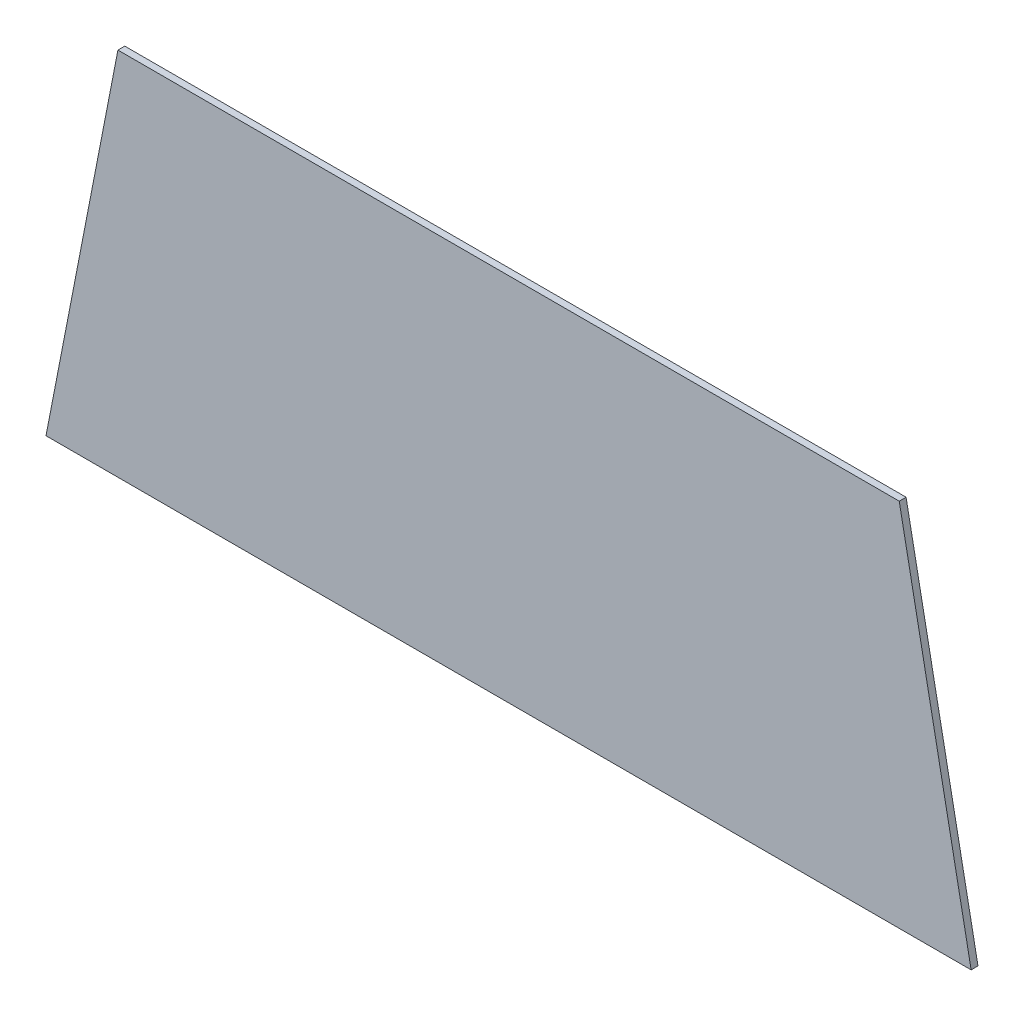
ISO-10303-21;
HEADER;
FILE_DESCRIPTION(('STEP AP214'),'2;1');
FILE_NAME('part.step','',(''),(''),'','','');
FILE_SCHEMA(('AUTOMOTIVE_DESIGN { 1 0 10303 214 1 1 1 1 }'));
ENDSEC;
DATA;
#1=APPLICATION_CONTEXT('core data for automotive mechanical design processes');
#2=APPLICATION_PROTOCOL_DEFINITION('international standard','automotive_design',2000,#1);
#3=PRODUCT_CONTEXT('',#1,'mechanical');
#4=PRODUCT('Part','Part','',(#3));
#5=PRODUCT_RELATED_PRODUCT_CATEGORY('part','',(#4));
#6=PRODUCT_DEFINITION_FORMATION('','',#4);
#7=PRODUCT_DEFINITION_CONTEXT('part definition',#1,'design');
#8=PRODUCT_DEFINITION('design','',#6,#7);
#9=PRODUCT_DEFINITION_SHAPE('','',#8);
#10=(LENGTH_UNIT() NAMED_UNIT(*) SI_UNIT(.MILLI.,.METRE.));
#11=(NAMED_UNIT(*) PLANE_ANGLE_UNIT() SI_UNIT($,.RADIAN.));
#12=(NAMED_UNIT(*) SI_UNIT($,.STERADIAN.) SOLID_ANGLE_UNIT());
#13=UNCERTAINTY_MEASURE_WITH_UNIT(LENGTH_MEASURE(1.E-05),#10,'distance_accuracy_value','');
#14=(GEOMETRIC_REPRESENTATION_CONTEXT(3) GLOBAL_UNCERTAINTY_ASSIGNED_CONTEXT((#13)) GLOBAL_UNIT_ASSIGNED_CONTEXT((#10,
#11,#12)) REPRESENTATION_CONTEXT('',''));
#15=CARTESIAN_POINT('',(0.,0.,0.));
#16=DIRECTION('',(0.,0.,1.));
#17=DIRECTION('',(1.,0.,0.));
#18=AXIS2_PLACEMENT_3D('',#15,#16,#17);
#19=CARTESIAN_POINT('',(-0.67499992,-0.26994612,0.01));
#20=DIRECTION('',(0.,0.,1.));
#21=DIRECTION('',(1.,0.,0.));
#22=AXIS2_PLACEMENT_3D('',#19,#20,#21);
#23=PLANE('',#22);
#24=DIRECTION('',(1.,0.,0.));
#25=VECTOR('',#24,1.);
#26=CARTESIAN_POINT('',(-0.57005474,0.26994866,0.01));
#27=LINE('',#26,#25);
#28=CARTESIAN_POINT('',(-0.57005474,0.26994866,0.01));
#29=VERTEX_POINT('',#28);
#30=CARTESIAN_POINT('',(0.57005474,0.26994866,0.01));
#31=VERTEX_POINT('',#30);
#32=EDGE_CURVE('E69',#29,#31,#27,.T.);
#33=ORIENTED_EDGE('',*,*,#32,.F.);
#34=DIRECTION('',(-0.190809460987009,-0.981627092942043,0.));
#35=VECTOR('',#34,1.);
#36=CARTESIAN_POINT('',(-0.57005474,0.26994866,0.01));
#37=LINE('',#36,#35);
#38=CARTESIAN_POINT('',(-0.67499992,-0.26994612,0.01));
#39=VERTEX_POINT('',#38);
#40=EDGE_CURVE('E72',#29,#39,#37,.T.);
#41=ORIENTED_EDGE('',*,*,#40,.T.);
#42=DIRECTION('',(-1.,0.,0.));
#43=VECTOR('',#42,1.);
#44=CARTESIAN_POINT('',(0.67499992,-0.26994612,0.01));
#45=LINE('',#44,#43);
#46=CARTESIAN_POINT('',(0.67499992,-0.26994612,0.01));
#47=VERTEX_POINT('',#46);
#48=EDGE_CURVE('E11',#47,#39,#45,.T.);
#49=ORIENTED_EDGE('',*,*,#48,.F.);
#50=DIRECTION('',(0.190809460987009,-0.981627092942043,0.));
#51=VECTOR('',#50,1.);
#52=CARTESIAN_POINT('',(0.57005474,0.26994866,0.01));
#53=LINE('',#52,#51);
#54=EDGE_CURVE('E27',#31,#47,#53,.T.);
#55=ORIENTED_EDGE('',*,*,#54,.F.);
#56=EDGE_LOOP('',(#33,#41,#49,#55));
#57=FACE_BOUND('',#56,.T.);
#58=ADVANCED_FACE('F16',(#57),#23,.T.);
#59=CARTESIAN_POINT('',(0.67499992,-0.26994612,0.));
#60=DIRECTION('',(0.,-1.,0.));
#61=DIRECTION('',(0.,0.,-1.));
#62=AXIS2_PLACEMENT_3D('',#59,#60,#61);
#63=PLANE('',#62);
#64=DIRECTION('',(0.,0.,1.));
#65=VECTOR('',#64,1.);
#66=CARTESIAN_POINT('',(-0.67499992,-0.26994612,0.));
#67=LINE('',#66,#65);
#68=CARTESIAN_POINT('',(-0.67499992,-0.26994612,0.));
#69=VERTEX_POINT('',#68);
#70=EDGE_CURVE('E116',#69,#39,#67,.T.);
#71=ORIENTED_EDGE('',*,*,#70,.F.);
#72=DIRECTION('',(1.,0.,0.));
#73=VECTOR('',#72,1.);
#74=CARTESIAN_POINT('',(-0.67499992,-0.26994612,0.));
#75=LINE('',#74,#73);
#76=CARTESIAN_POINT('',(0.67499992,-0.26994612,0.));
#77=VERTEX_POINT('',#76);
#78=EDGE_CURVE('E84',#69,#77,#75,.T.);
#79=ORIENTED_EDGE('',*,*,#78,.T.);
#80=DIRECTION('',(0.,0.,-1.));
#81=VECTOR('',#80,1.);
#82=CARTESIAN_POINT('',(0.67499992,-0.26994612,0.));
#83=LINE('',#82,#81);
#84=EDGE_CURVE('E79',#47,#77,#83,.T.);
#85=ORIENTED_EDGE('',*,*,#84,.F.);
#86=ORIENTED_EDGE('',*,*,#48,.T.);
#87=EDGE_LOOP('',(#71,#79,#85,#86));
#88=FACE_BOUND('',#87,.T.);
#89=ADVANCED_FACE('F182',(#88),#63,.T.);
#90=CARTESIAN_POINT('',(0.57005474,0.26994866,0.));
#91=DIRECTION('',(0.981627092942043,0.190809460987009,0.));
#92=DIRECTION('',(0.,0.,-1.));
#93=AXIS2_PLACEMENT_3D('',#90,#91,#92);
#94=PLANE('',#93);
#95=ORIENTED_EDGE('',*,*,#84,.T.);
#96=DIRECTION('',(-0.190809460987009,0.981627092942043,0.));
#97=VECTOR('',#96,1.);
#98=CARTESIAN_POINT('',(0.67499992,-0.26994612,0.));
#99=LINE('',#98,#97);
#100=CARTESIAN_POINT('',(0.57005474,0.26994866,0.));
#101=VERTEX_POINT('',#100);
#102=EDGE_CURVE('E76',#77,#101,#99,.T.);
#103=ORIENTED_EDGE('',*,*,#102,.T.);
#104=DIRECTION('',(0.,0.,-1.));
#105=VECTOR('',#104,1.);
#106=CARTESIAN_POINT('',(0.57005474,0.26994866,0.));
#107=LINE('',#106,#105);
#108=EDGE_CURVE('E65',#31,#101,#107,.T.);
#109=ORIENTED_EDGE('',*,*,#108,.F.);
#110=ORIENTED_EDGE('',*,*,#54,.T.);
#111=EDGE_LOOP('',(#95,#103,#109,#110));
#112=FACE_BOUND('',#111,.T.);
#113=ADVANCED_FACE('F77',(#112),#94,.T.);
#114=CARTESIAN_POINT('',(-0.57005474,0.26994866,0.));
#115=DIRECTION('',(0.,1.,0.));
#116=DIRECTION('',(1.,0.,0.));
#117=AXIS2_PLACEMENT_3D('',#114,#115,#116);
#118=PLANE('',#117);
#119=ORIENTED_EDGE('',*,*,#108,.T.);
#120=DIRECTION('',(-1.,0.,0.));
#121=VECTOR('',#120,1.);
#122=CARTESIAN_POINT('',(-0.67499992,0.26994866,0.));
#123=LINE('',#122,#121);
#124=CARTESIAN_POINT('',(-0.57005474,0.26994866,0.));
#125=VERTEX_POINT('',#124);
#126=EDGE_CURVE('E20',#101,#125,#123,.T.);
#127=ORIENTED_EDGE('',*,*,#126,.T.);
#128=DIRECTION('',(0.,0.,-1.));
#129=VECTOR('',#128,1.);
#130=CARTESIAN_POINT('',(-0.57005474,0.26994866,0.));
#131=LINE('',#130,#129);
#132=EDGE_CURVE('E112',#29,#125,#131,.T.);
#133=ORIENTED_EDGE('',*,*,#132,.F.);
#134=ORIENTED_EDGE('',*,*,#32,.T.);
#135=EDGE_LOOP('',(#119,#127,#133,#134));
#136=FACE_BOUND('',#135,.T.);
#137=ADVANCED_FACE('F18',(#136),#118,.T.);
#138=CARTESIAN_POINT('',(-0.67499992,-0.26994612,0.));
#139=DIRECTION('',(-0.981627092942043,0.190809460987009,0.));
#140=DIRECTION('',(0.,0.,1.));
#141=AXIS2_PLACEMENT_3D('',#138,#139,#140);
#142=PLANE('',#141);
#143=ORIENTED_EDGE('',*,*,#132,.T.);
#144=DIRECTION('',(-0.190809460987009,-0.981627092942043,0.));
#145=VECTOR('',#144,1.);
#146=CARTESIAN_POINT('',(-0.57005474,0.26994866,0.));
#147=LINE('',#146,#145);
#148=EDGE_CURVE('E89',#125,#69,#147,.T.);
#149=ORIENTED_EDGE('',*,*,#148,.T.);
#150=ORIENTED_EDGE('',*,*,#70,.T.);
#151=ORIENTED_EDGE('',*,*,#40,.F.);
#152=EDGE_LOOP('',(#143,#149,#150,#151));
#153=FACE_BOUND('',#152,.T.);
#154=ADVANCED_FACE('F154',(#153),#142,.T.);
#155=CARTESIAN_POINT('',(-0.67499992,-0.26994612,0.));
#156=DIRECTION('',(0.,0.,1.));
#157=DIRECTION('',(1.,0.,0.));
#158=AXIS2_PLACEMENT_3D('',#155,#156,#157);
#159=PLANE('',#158);
#160=ORIENTED_EDGE('',*,*,#126,.F.);
#161=ORIENTED_EDGE('',*,*,#102,.F.);
#162=ORIENTED_EDGE('',*,*,#78,.F.);
#163=ORIENTED_EDGE('',*,*,#148,.F.);
#164=EDGE_LOOP('',(#160,#161,#162,#163));
#165=FACE_BOUND('',#164,.T.);
#166=ADVANCED_FACE('F87',(#165),#159,.F.);
#167=CLOSED_SHELL('',(#58,#89,#113,#137,#154,#166));
#168=MANIFOLD_SOLID_BREP('B1',#167);
#169=ADVANCED_BREP_SHAPE_REPRESENTATION('',(#18,#168),#14);
#170=SHAPE_DEFINITION_REPRESENTATION(#9,#169);
ENDSEC;
END-ISO-10303-21;
